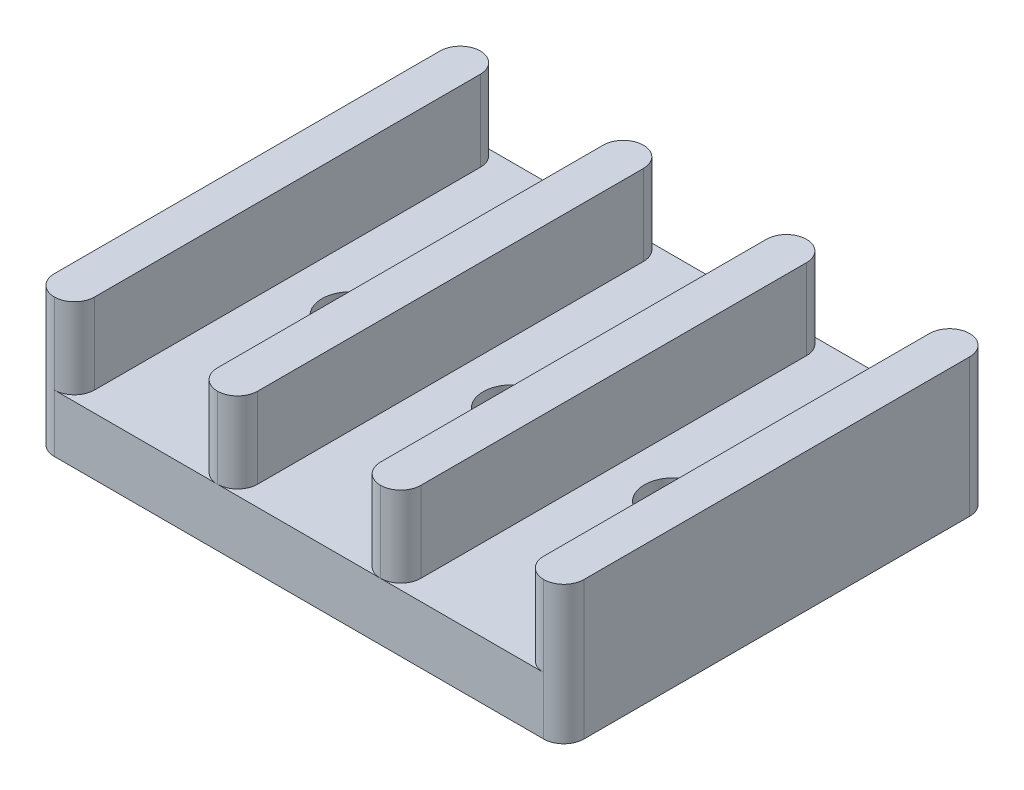
ISO-10303-21;
HEADER;
FILE_DESCRIPTION(('STEP AP214'),'2;1');
FILE_NAME('part.step','',(''),(''),'','','');
FILE_SCHEMA(('AUTOMOTIVE_DESIGN { 1 0 10303 214 1 1 1 1 }'));
ENDSEC;
DATA;
#1=APPLICATION_CONTEXT('core data for automotive mechanical design processes');
#2=APPLICATION_PROTOCOL_DEFINITION('international standard','automotive_design',2000,#1);
#3=PRODUCT_CONTEXT('',#1,'mechanical');
#4=PRODUCT('Part','Part','',(#3));
#5=PRODUCT_RELATED_PRODUCT_CATEGORY('part','',(#4));
#6=PRODUCT_DEFINITION_FORMATION('','',#4);
#7=PRODUCT_DEFINITION_CONTEXT('part definition',#1,'design');
#8=PRODUCT_DEFINITION('design','',#6,#7);
#9=PRODUCT_DEFINITION_SHAPE('','',#8);
#10=(LENGTH_UNIT() NAMED_UNIT(*) SI_UNIT(.MILLI.,.METRE.));
#11=(NAMED_UNIT(*) PLANE_ANGLE_UNIT() SI_UNIT($,.RADIAN.));
#12=(NAMED_UNIT(*) SI_UNIT($,.STERADIAN.) SOLID_ANGLE_UNIT());
#13=UNCERTAINTY_MEASURE_WITH_UNIT(LENGTH_MEASURE(1.E-05),#10,'distance_accuracy_value','');
#14=(GEOMETRIC_REPRESENTATION_CONTEXT(3) GLOBAL_UNCERTAINTY_ASSIGNED_CONTEXT((#13)) GLOBAL_UNIT_ASSIGNED_CONTEXT((#10,
#11,#12)) REPRESENTATION_CONTEXT('',''));
#15=CARTESIAN_POINT('',(0.,0.,0.));
#16=DIRECTION('',(0.,0.,1.));
#17=DIRECTION('',(1.,0.,0.));
#18=AXIS2_PLACEMENT_3D('',#15,#16,#17);
#19=CARTESIAN_POINT('',(0.,12.,0.));
#20=DIRECTION('',(0.,1.,0.));
#21=DIRECTION('',(0.,0.,1.));
#22=AXIS2_PLACEMENT_3D('',#19,#20,#21);
#23=PLANE('',#22);
#24=CARTESIAN_POINT('',(-8.48242676399027,12.,13.1453771289538));
#25=DIRECTION('',(0.,1.,0.));
#26=DIRECTION('',(0.,0.,1.));
#27=AXIS2_PLACEMENT_3D('',#24,#25,#26);
#28=CIRCLE('',#27,1.75);
#29=CARTESIAN_POINT('',(-10.2324267639903,12.,13.1453771289538));
#30=VERTEX_POINT('',#29);
#31=CARTESIAN_POINT('',(-8.48242676399028,12.,14.8953771289538));
#32=VERTEX_POINT('',#31);
#33=EDGE_CURVE('E247',#30,#32,#28,.T.);
#34=ORIENTED_EDGE('',*,*,#33,.T.);
#35=CARTESIAN_POINT('',(-8.48242676399027,12.,13.1453771289538));
#36=DIRECTION('',(0.,1.,0.));
#37=DIRECTION('',(0.,0.,1.));
#38=AXIS2_PLACEMENT_3D('',#35,#36,#37);
#39=CIRCLE('',#38,1.75);
#40=CARTESIAN_POINT('',(-6.73242676399027,12.,13.1453771289538));
#41=VERTEX_POINT('',#40);
#42=EDGE_CURVE('E249',#32,#41,#39,.T.);
#43=ORIENTED_EDGE('',*,*,#42,.T.);
#44=DIRECTION('',(0.,0.,1.));
#45=VECTOR('',#44,1.);
#46=CARTESIAN_POINT('',(-6.73242676399027,12.,0.));
#47=LINE('',#46,#45);
#48=CARTESIAN_POINT('',(-6.73242676399027,12.,-20.3546228710462));
#49=VERTEX_POINT('',#48);
#50=EDGE_CURVE('E229',#49,#41,#47,.T.);
#51=ORIENTED_EDGE('',*,*,#50,.F.);
#52=CARTESIAN_POINT('',(-8.48242676399027,12.,-20.3546228710462));
#53=DIRECTION('',(0.,1.,0.));
#54=DIRECTION('',(0.,0.,1.));
#55=AXIS2_PLACEMENT_3D('',#52,#53,#54);
#56=CIRCLE('',#55,1.75);
#57=CARTESIAN_POINT('',(-8.48242676399028,12.,-22.1046228710462));
#58=VERTEX_POINT('',#57);
#59=EDGE_CURVE('E222',#49,#58,#56,.T.);
#60=ORIENTED_EDGE('',*,*,#59,.T.);
#61=CARTESIAN_POINT('',(-8.48242676399028,12.,-20.3546228710462));
#62=DIRECTION('',(0.,1.,0.));
#63=DIRECTION('',(0.,0.,1.));
#64=AXIS2_PLACEMENT_3D('',#61,#62,#63);
#65=CIRCLE('',#64,1.75);
#66=CARTESIAN_POINT('',(-10.2324267639903,12.,-20.3546228710462));
#67=VERTEX_POINT('',#66);
#68=EDGE_CURVE('E226',#58,#67,#65,.T.);
#69=ORIENTED_EDGE('',*,*,#68,.T.);
#70=DIRECTION('',(0.,0.,1.));
#71=VECTOR('',#70,1.);
#72=CARTESIAN_POINT('',(-10.2324267639903,12.,0.));
#73=LINE('',#72,#71);
#74=EDGE_CURVE('E403',#67,#30,#73,.T.);
#75=ORIENTED_EDGE('',*,*,#74,.T.);
#76=EDGE_LOOP('',(#34,#43,#51,#60,#69,#75));
#77=FACE_BOUND('',#76,.T.);
#78=ADVANCED_FACE('F39',(#77),#23,.T.);
#79=DIRECTION('',(0.,0.,1.));
#80=VECTOR('',#79,1.);
#81=CARTESIAN_POINT('',(3.93417323600973,12.,0.));
#82=LINE('',#81,#80);
#83=CARTESIAN_POINT('',(3.93417323600973,12.,-20.3546228710462));
#84=VERTEX_POINT('',#83);
#85=CARTESIAN_POINT('',(3.93417323600973,12.,13.1453771289538));
#86=VERTEX_POINT('',#85);
#87=EDGE_CURVE('E378',#84,#86,#82,.T.);
#88=ORIENTED_EDGE('',*,*,#87,.T.);
#89=CARTESIAN_POINT('',(5.68417323600973,12.,13.1453771289538));
#90=DIRECTION('',(0.,1.,0.));
#91=DIRECTION('',(0.,0.,1.));
#92=AXIS2_PLACEMENT_3D('',#89,#90,#91);
#93=CIRCLE('',#92,1.75);
#94=CARTESIAN_POINT('',(5.68417323600973,12.,14.8953771289538));
#95=VERTEX_POINT('',#94);
#96=EDGE_CURVE('E364',#86,#95,#93,.T.);
#97=ORIENTED_EDGE('',*,*,#96,.T.);
#98=CARTESIAN_POINT('',(5.68417323600973,12.,13.1453771289538));
#99=DIRECTION('',(0.,1.,0.));
#100=DIRECTION('',(0.,0.,1.));
#101=AXIS2_PLACEMENT_3D('',#98,#99,#100);
#102=CIRCLE('',#101,1.75);
#103=CARTESIAN_POINT('',(7.43417323600973,12.,13.1453771289538));
#104=VERTEX_POINT('',#103);
#105=EDGE_CURVE('E362',#95,#104,#102,.T.);
#106=ORIENTED_EDGE('',*,*,#105,.T.);
#107=DIRECTION('',(0.,0.,1.));
#108=VECTOR('',#107,1.);
#109=CARTESIAN_POINT('',(7.43417323600973,12.,0.));
#110=LINE('',#109,#108);
#111=CARTESIAN_POINT('',(7.43417323600973,12.,-20.3546228710462));
#112=VERTEX_POINT('',#111);
#113=EDGE_CURVE('E410',#112,#104,#110,.T.);
#114=ORIENTED_EDGE('',*,*,#113,.F.);
#115=CARTESIAN_POINT('',(5.68417323600973,12.,-20.3546228710462));
#116=DIRECTION('',(0.,1.,0.));
#117=DIRECTION('',(0.,0.,1.));
#118=AXIS2_PLACEMENT_3D('',#115,#116,#117);
#119=CIRCLE('',#118,1.75);
#120=CARTESIAN_POINT('',(5.68417323600973,12.,-22.1046228710462));
#121=VERTEX_POINT('',#120);
#122=EDGE_CURVE('E358',#112,#121,#119,.T.);
#123=ORIENTED_EDGE('',*,*,#122,.T.);
#124=CARTESIAN_POINT('',(5.68417323600973,12.,-20.3546228710462));
#125=DIRECTION('',(0.,1.,0.));
#126=DIRECTION('',(0.,0.,1.));
#127=AXIS2_PLACEMENT_3D('',#124,#125,#126);
#128=CIRCLE('',#127,1.75);
#129=EDGE_CURVE('E360',#121,#84,#128,.T.);
#130=ORIENTED_EDGE('',*,*,#129,.T.);
#131=EDGE_LOOP('',(#88,#97,#106,#114,#123,#130));
#132=FACE_BOUND('',#131,.T.);
#133=ADVANCED_FACE('F528',(#132),#23,.T.);
#134=DIRECTION('',(-1.,0.,0.));
#135=VECTOR('',#134,1.);
#136=CARTESIAN_POINT('',(21.6009732360097,12.,-22.1046228710462));
#137=LINE('',#136,#135);
#138=CARTESIAN_POINT('',(19.8509732360097,12.,-22.1046228710462));
#139=VERTEX_POINT('',#138);
#140=CARTESIAN_POINT('',(19.8507732360097,12.,-22.1046228710462));
#141=VERTEX_POINT('',#140);
#142=EDGE_CURVE('E437',#139,#141,#137,.T.);
#143=ORIENTED_EDGE('',*,*,#142,.T.);
#144=CARTESIAN_POINT('',(19.8507732360097,12.,-20.3546228710462));
#145=DIRECTION('',(0.,1.,0.));
#146=DIRECTION('',(0.,0.,1.));
#147=AXIS2_PLACEMENT_3D('',#144,#145,#146);
#148=CIRCLE('',#147,1.75);
#149=CARTESIAN_POINT('',(18.1007732360097,12.,-20.3546228710462));
#150=VERTEX_POINT('',#149);
#151=EDGE_CURVE('E470',#141,#150,#148,.T.);
#152=ORIENTED_EDGE('',*,*,#151,.T.);
#153=DIRECTION('',(0.,0.,1.));
#154=VECTOR('',#153,1.);
#155=CARTESIAN_POINT('',(18.1007732360097,12.,0.));
#156=LINE('',#155,#154);
#157=CARTESIAN_POINT('',(18.1007732360097,12.,13.1453771289538));
#158=VERTEX_POINT('',#157);
#159=EDGE_CURVE('E320',#150,#158,#156,.T.);
#160=ORIENTED_EDGE('',*,*,#159,.T.);
#161=CARTESIAN_POINT('',(19.8507732360097,12.,13.1453771289538));
#162=DIRECTION('',(0.,1.,0.));
#163=DIRECTION('',(0.,0.,1.));
#164=AXIS2_PLACEMENT_3D('',#161,#162,#163);
#165=CIRCLE('',#164,1.75);
#166=CARTESIAN_POINT('',(19.8507732360097,12.,14.8953771289538));
#167=VERTEX_POINT('',#166);
#168=EDGE_CURVE('E468',#158,#167,#165,.T.);
#169=ORIENTED_EDGE('',*,*,#168,.T.);
#170=DIRECTION('',(1.,0.,0.));
#171=VECTOR('',#170,1.);
#172=CARTESIAN_POINT('',(21.6009732360097,12.,14.8953771289538));
#173=LINE('',#172,#171);
#174=CARTESIAN_POINT('',(19.8509732360097,12.,14.8953771289538));
#175=VERTEX_POINT('',#174);
#176=EDGE_CURVE('E444',#167,#175,#173,.T.);
#177=ORIENTED_EDGE('',*,*,#176,.T.);
#178=CARTESIAN_POINT('',(19.8509732360097,12.,13.1453771289538));
#179=DIRECTION('',(0.,1.,0.));
#180=DIRECTION('',(0.,0.,1.));
#181=AXIS2_PLACEMENT_3D('',#178,#179,#180);
#182=CIRCLE('',#181,1.75);
#183=CARTESIAN_POINT('',(21.6009732360097,12.,13.1453771289538));
#184=VERTEX_POINT('',#183);
#185=EDGE_CURVE('E464',#175,#184,#182,.T.);
#186=ORIENTED_EDGE('',*,*,#185,.T.);
#187=DIRECTION('',(0.,0.,-1.));
#188=VECTOR('',#187,1.);
#189=CARTESIAN_POINT('',(21.6009732360097,12.,14.8953771289538));
#190=LINE('',#189,#188);
#191=CARTESIAN_POINT('',(21.6009732360097,12.,-20.3546228710462));
#192=VERTEX_POINT('',#191);
#193=EDGE_CURVE('E434',#184,#192,#190,.T.);
#194=ORIENTED_EDGE('',*,*,#193,.T.);
#195=CARTESIAN_POINT('',(19.8509732360097,12.,-20.3546228710462));
#196=DIRECTION('',(0.,1.,0.));
#197=DIRECTION('',(0.,0.,1.));
#198=AXIS2_PLACEMENT_3D('',#195,#196,#197);
#199=CIRCLE('',#198,1.75);
#200=EDGE_CURVE('E466',#192,#139,#199,.T.);
#201=ORIENTED_EDGE('',*,*,#200,.T.);
#202=EDGE_LOOP('',(#143,#152,#160,#169,#177,#186,#194,#201));
#203=FACE_BOUND('',#202,.T.);
#204=ADVANCED_FACE('F481',(#203),#23,.T.);
#205=CARTESIAN_POINT('',(21.6009732360097,12.,-22.1046228710462));
#206=DIRECTION('',(0.,0.,1.));
#207=DIRECTION('',(1.,0.,0.));
#208=AXIS2_PLACEMENT_3D('',#205,#206,#207);
#209=PLANE('',#208);
#210=DIRECTION('',(-1.,0.,0.));
#211=VECTOR('',#210,1.);
#212=CARTESIAN_POINT('',(0.,5.,-22.1046228710462));
#213=LINE('',#212,#211);
#214=CARTESIAN_POINT('',(19.8507732360097,5.,-22.1046228710462));
#215=VERTEX_POINT('',#214);
#216=CARTESIAN_POINT('',(5.68417323600973,5.,-22.1046228710462));
#217=VERTEX_POINT('',#216);
#218=EDGE_CURVE('E409',#215,#217,#213,.T.);
#219=ORIENTED_EDGE('',*,*,#218,.F.);
#220=DIRECTION('',(0.,1.,0.));
#221=VECTOR('',#220,1.);
#222=CARTESIAN_POINT('',(19.8507732360097,12.,-22.1046228710462));
#223=LINE('',#222,#221);
#224=EDGE_CURVE('E461',#215,#141,#223,.T.);
#225=ORIENTED_EDGE('',*,*,#224,.T.);
#226=ORIENTED_EDGE('',*,*,#142,.F.);
#227=DIRECTION('',(0.,-1.,0.));
#228=VECTOR('',#227,1.);
#229=CARTESIAN_POINT('',(19.8509732360097,12.,-22.1046228710462));
#230=LINE('',#229,#228);
#231=CARTESIAN_POINT('',(19.8509732360097,0.,-22.1046228710462));
#232=VERTEX_POINT('',#231);
#233=EDGE_CURVE('E447',#139,#232,#230,.T.);
#234=ORIENTED_EDGE('',*,*,#233,.T.);
#235=DIRECTION('',(-1.,0.,0.));
#236=VECTOR('',#235,1.);
#237=CARTESIAN_POINT('',(21.6009732360097,0.,-22.1046228710462));
#238=LINE('',#237,#236);
#239=CARTESIAN_POINT('',(-22.6490267639903,0.,-22.1046228710462));
#240=VERTEX_POINT('',#239);
#241=EDGE_CURVE('E449',#232,#240,#238,.T.);
#242=ORIENTED_EDGE('',*,*,#241,.T.);
#243=DIRECTION('',(0.,-1.,0.));
#244=VECTOR('',#243,1.);
#245=CARTESIAN_POINT('',(-22.6490267639903,12.,-22.1046228710462));
#246=LINE('',#245,#244);
#247=CARTESIAN_POINT('',(-22.6490267639903,5.,-22.1046228710462));
#248=VERTEX_POINT('',#247);
#249=EDGE_CURVE('E458',#240,#248,#246,.F.);
#250=ORIENTED_EDGE('',*,*,#249,.T.);
#251=DIRECTION('',(-1.,0.,0.));
#252=VECTOR('',#251,1.);
#253=CARTESIAN_POINT('',(0.,5.,-22.1046228710462));
#254=LINE('',#253,#252);
#255=CARTESIAN_POINT('',(-8.48242676399027,5.,-22.1046228710462));
#256=VERTEX_POINT('',#255);
#257=EDGE_CURVE('E857',#256,#248,#254,.T.);
#258=ORIENTED_EDGE('',*,*,#257,.F.);
#259=DIRECTION('',(-1.,0.,0.));
#260=VECTOR('',#259,1.);
#261=CARTESIAN_POINT('',(0.,5.,-22.1046228710462));
#262=LINE('',#261,#260);
#263=EDGE_CURVE('E387',#217,#256,#262,.T.);
#264=ORIENTED_EDGE('',*,*,#263,.F.);
#265=EDGE_LOOP('',(#219,#225,#226,#234,#242,#250,#258,#264));
#266=FACE_BOUND('',#265,.T.);
#267=ADVANCED_FACE('F489',(#266),#209,.F.);
#268=CARTESIAN_POINT('',(21.6009732360097,12.,14.8953771289538));
#269=DIRECTION('',(0.,0.,-1.));
#270=DIRECTION('',(-1.,0.,0.));
#271=AXIS2_PLACEMENT_3D('',#268,#269,#270);
#272=PLANE('',#271);
#273=ORIENTED_EDGE('',*,*,#176,.F.);
#274=DIRECTION('',(0.,1.,0.));
#275=VECTOR('',#274,1.);
#276=CARTESIAN_POINT('',(19.8507732360097,5.,14.8953771289538));
#277=LINE('',#276,#275);
#278=CARTESIAN_POINT('',(19.8507732360097,5.,14.8953771289538));
#279=VERTEX_POINT('',#278);
#280=EDGE_CURVE('E350',#167,#279,#277,.F.);
#281=ORIENTED_EDGE('',*,*,#280,.T.);
#282=DIRECTION('',(1.,0.,0.));
#283=VECTOR('',#282,1.);
#284=CARTESIAN_POINT('',(0.,5.,14.8953771289538));
#285=LINE('',#284,#283);
#286=CARTESIAN_POINT('',(5.68417323600973,5.,14.8953771289538));
#287=VERTEX_POINT('',#286);
#288=EDGE_CURVE('E415',#287,#279,#285,.T.);
#289=ORIENTED_EDGE('',*,*,#288,.F.);
#290=DIRECTION('',(1.,0.,0.));
#291=VECTOR('',#290,1.);
#292=CARTESIAN_POINT('',(0.,5.,14.8953771289538));
#293=LINE('',#292,#291);
#294=CARTESIAN_POINT('',(-8.48242676399027,5.,14.8953771289538));
#295=VERTEX_POINT('',#294);
#296=EDGE_CURVE('E398',#295,#287,#293,.T.);
#297=ORIENTED_EDGE('',*,*,#296,.F.);
#298=DIRECTION('',(1.,0.,0.));
#299=VECTOR('',#298,1.);
#300=CARTESIAN_POINT('',(0.,5.,14.8953771289538));
#301=LINE('',#300,#299);
#302=CARTESIAN_POINT('',(-22.6490267639903,5.,14.8953771289538));
#303=VERTEX_POINT('',#302);
#304=EDGE_CURVE('E848',#303,#295,#301,.T.);
#305=ORIENTED_EDGE('',*,*,#304,.F.);
#306=DIRECTION('',(0.,-1.,0.));
#307=VECTOR('',#306,1.);
#308=CARTESIAN_POINT('',(-22.6490267639903,12.,14.8953771289538));
#309=LINE('',#308,#307);
#310=CARTESIAN_POINT('',(-22.6490267639903,0.,14.8953771289538));
#311=VERTEX_POINT('',#310);
#312=EDGE_CURVE('E343',#303,#311,#309,.T.);
#313=ORIENTED_EDGE('',*,*,#312,.T.);
#314=DIRECTION('',(1.,0.,0.));
#315=VECTOR('',#314,1.);
#316=CARTESIAN_POINT('',(21.6009732360097,0.,14.8953771289538));
#317=LINE('',#316,#315);
#318=CARTESIAN_POINT('',(19.8509732360097,0.,14.8953771289538));
#319=VERTEX_POINT('',#318);
#320=EDGE_CURVE('E438',#311,#319,#317,.T.);
#321=ORIENTED_EDGE('',*,*,#320,.T.);
#322=DIRECTION('',(0.,-1.,0.));
#323=VECTOR('',#322,1.);
#324=CARTESIAN_POINT('',(19.8509732360097,12.,14.8953771289538));
#325=LINE('',#324,#323);
#326=EDGE_CURVE('E347',#319,#175,#325,.F.);
#327=ORIENTED_EDGE('',*,*,#326,.T.);
#328=EDGE_LOOP('',(#273,#281,#289,#297,#305,#313,#321,#327));
#329=FACE_BOUND('',#328,.T.);
#330=ADVANCED_FACE('F498',(#329),#272,.F.);
#331=CARTESIAN_POINT('',(-1.39902676399028,12.,-3.60462287104624));
#332=DIRECTION('',(0.,-1.,0.));
#333=DIRECTION('',(0.,0.,-1.));
#334=AXIS2_PLACEMENT_3D('',#331,#332,#333);
#335=CYLINDRICAL_SURFACE('',#334,2.5);
#336=CARTESIAN_POINT('',(-1.39902676399028,0.,-3.60462287104624));
#337=DIRECTION('',(0.,1.,0.));
#338=DIRECTION('',(0.,0.,1.));
#339=AXIS2_PLACEMENT_3D('',#336,#337,#338);
#340=CIRCLE('',#339,2.5);
#341=CARTESIAN_POINT('',(-1.39902676399028,0.,-1.10462287104624));
#342=VERTEX_POINT('',#341);
#343=EDGE_CURVE('E430',#342,#342,#340,.T.);
#344=ORIENTED_EDGE('',*,*,#343,.F.);
#345=EDGE_LOOP('',(#344));
#346=FACE_BOUND('',#345,.T.);
#347=CARTESIAN_POINT('',(-1.39902676399028,5.,-3.60462287104624));
#348=DIRECTION('',(0.,1.,0.));
#349=DIRECTION('',(0.,0.,1.));
#350=AXIS2_PLACEMENT_3D('',#347,#348,#349);
#351=CIRCLE('',#350,2.5);
#352=CARTESIAN_POINT('',(-1.39902676399028,5.,-1.10462287104624));
#353=VERTEX_POINT('',#352);
#354=EDGE_CURVE('E400',#353,#353,#351,.F.);
#355=ORIENTED_EDGE('',*,*,#354,.F.);
#356=EDGE_LOOP('',(#355));
#357=FACE_BOUND('',#356,.T.);
#358=ADVANCED_FACE('F556',(#346,#357),#335,.F.);
#359=CARTESIAN_POINT('',(-15.3990267639903,12.,-3.60462287104624));
#360=DIRECTION('',(0.,-1.,0.));
#361=DIRECTION('',(0.,0.,-1.));
#362=AXIS2_PLACEMENT_3D('',#359,#360,#361);
#363=CYLINDRICAL_SURFACE('',#362,2.5);
#364=CARTESIAN_POINT('',(-15.3990267639903,0.,-3.60462287104624));
#365=DIRECTION('',(0.,1.,0.));
#366=DIRECTION('',(0.,0.,1.));
#367=AXIS2_PLACEMENT_3D('',#364,#365,#366);
#368=CIRCLE('',#367,2.5);
#369=CARTESIAN_POINT('',(-15.3990267639903,0.,-1.10462287104624));
#370=VERTEX_POINT('',#369);
#371=EDGE_CURVE('E426',#370,#370,#368,.T.);
#372=ORIENTED_EDGE('',*,*,#371,.F.);
#373=EDGE_LOOP('',(#372));
#374=FACE_BOUND('',#373,.T.);
#375=CARTESIAN_POINT('',(-15.3990267639903,5.,-3.60462287104624));
#376=DIRECTION('',(0.,1.,0.));
#377=DIRECTION('',(0.,0.,1.));
#378=AXIS2_PLACEMENT_3D('',#375,#376,#377);
#379=CIRCLE('',#378,2.5);
#380=CARTESIAN_POINT('',(-15.3990267639903,5.,-1.10462287104624));
#381=VERTEX_POINT('',#380);
#382=EDGE_CURVE('E427',#381,#381,#379,.F.);
#383=ORIENTED_EDGE('',*,*,#382,.F.);
#384=EDGE_LOOP('',(#383));
#385=FACE_BOUND('',#384,.T.);
#386=ADVANCED_FACE('F545',(#374,#385),#363,.F.);
#387=CARTESIAN_POINT('',(12.6009732360097,12.,-3.60462287104624));
#388=DIRECTION('',(0.,-1.,0.));
#389=DIRECTION('',(0.,0.,-1.));
#390=AXIS2_PLACEMENT_3D('',#387,#388,#389);
#391=CYLINDRICAL_SURFACE('',#390,2.5);
#392=CARTESIAN_POINT('',(12.6009732360097,0.,-3.60462287104624));
#393=DIRECTION('',(0.,1.,0.));
#394=DIRECTION('',(0.,0.,1.));
#395=AXIS2_PLACEMENT_3D('',#392,#393,#394);
#396=CIRCLE('',#395,2.5);
#397=CARTESIAN_POINT('',(12.6009732360097,0.,-1.10462287104624));
#398=VERTEX_POINT('',#397);
#399=EDGE_CURVE('E423',#398,#398,#396,.T.);
#400=ORIENTED_EDGE('',*,*,#399,.F.);
#401=EDGE_LOOP('',(#400));
#402=FACE_BOUND('',#401,.T.);
#403=CARTESIAN_POINT('',(12.6009732360097,5.,-3.60462287104624));
#404=DIRECTION('',(0.,1.,0.));
#405=DIRECTION('',(0.,0.,1.));
#406=AXIS2_PLACEMENT_3D('',#403,#404,#405);
#407=CIRCLE('',#406,2.5);
#408=CARTESIAN_POINT('',(12.6009732360097,5.,-1.10462287104624));
#409=VERTEX_POINT('',#408);
#410=EDGE_CURVE('E404',#409,#409,#407,.F.);
#411=ORIENTED_EDGE('',*,*,#410,.F.);
#412=EDGE_LOOP('',(#411));
#413=FACE_BOUND('',#412,.T.);
#414=ADVANCED_FACE('F539',(#402,#413),#391,.F.);
#415=DIRECTION('',(0.,0.,1.));
#416=VECTOR('',#415,1.);
#417=CARTESIAN_POINT('',(-20.8990267639903,12.,0.));
#418=LINE('',#417,#416);
#419=CARTESIAN_POINT('',(-20.8990267639903,12.,-20.3546228710462));
#420=VERTEX_POINT('',#419);
#421=CARTESIAN_POINT('',(-20.8990267639903,12.,13.1453771289538));
#422=VERTEX_POINT('',#421);
#423=EDGE_CURVE('E393',#420,#422,#418,.T.);
#424=ORIENTED_EDGE('',*,*,#423,.F.);
#425=CARTESIAN_POINT('',(-22.6490267639903,12.,-20.3546228710462));
#426=DIRECTION('',(0.,1.,0.));
#427=DIRECTION('',(0.,0.,1.));
#428=AXIS2_PLACEMENT_3D('',#425,#426,#427);
#429=CIRCLE('',#428,1.75);
#430=CARTESIAN_POINT('',(-22.6490267639903,12.,-22.1046228710462));
#431=VERTEX_POINT('',#430);
#432=EDGE_CURVE('E278',#420,#431,#429,.T.);
#433=ORIENTED_EDGE('',*,*,#432,.T.);
#434=CARTESIAN_POINT('',(-22.6490267639903,12.,-20.3546228710462));
#435=DIRECTION('',(0.,1.,0.));
#436=DIRECTION('',(0.,0.,1.));
#437=AXIS2_PLACEMENT_3D('',#434,#435,#436);
#438=CIRCLE('',#437,1.75);
#439=CARTESIAN_POINT('',(-24.3990267639903,12.,-20.3546228710462));
#440=VERTEX_POINT('',#439);
#441=EDGE_CURVE('E276',#431,#440,#438,.T.);
#442=ORIENTED_EDGE('',*,*,#441,.T.);
#443=DIRECTION('',(0.,0.,1.));
#444=VECTOR('',#443,1.);
#445=CARTESIAN_POINT('',(-24.3990267639903,12.,14.8953771289538));
#446=LINE('',#445,#444);
#447=CARTESIAN_POINT('',(-24.3990267639903,12.,13.1453771289538));
#448=VERTEX_POINT('',#447);
#449=EDGE_CURVE('E441',#440,#448,#446,.T.);
#450=ORIENTED_EDGE('',*,*,#449,.T.);
#451=CARTESIAN_POINT('',(-22.6490267639903,12.,13.1453771289538));
#452=DIRECTION('',(0.,1.,0.));
#453=DIRECTION('',(0.,0.,1.));
#454=AXIS2_PLACEMENT_3D('',#451,#452,#453);
#455=CIRCLE('',#454,1.75);
#456=CARTESIAN_POINT('',(-22.6490267639903,12.,14.8953771289538));
#457=VERTEX_POINT('',#456);
#458=EDGE_CURVE('E272',#448,#457,#455,.T.);
#459=ORIENTED_EDGE('',*,*,#458,.T.);
#460=CARTESIAN_POINT('',(-22.6490267639903,12.,13.1453771289538));
#461=DIRECTION('',(0.,1.,0.));
#462=DIRECTION('',(0.,0.,1.));
#463=AXIS2_PLACEMENT_3D('',#460,#461,#462);
#464=CIRCLE('',#463,1.75);
#465=EDGE_CURVE('E274',#457,#422,#464,.T.);
#466=ORIENTED_EDGE('',*,*,#465,.T.);
#467=EDGE_LOOP('',(#424,#433,#442,#450,#459,#466));
#468=FACE_BOUND('',#467,.T.);
#469=ADVANCED_FACE('F530',(#468),#23,.T.);
#470=CARTESIAN_POINT('',(0.,0.,0.));
#471=DIRECTION('',(0.,1.,0.));
#472=DIRECTION('',(0.,0.,1.));
#473=AXIS2_PLACEMENT_3D('',#470,#471,#472);
#474=PLANE('',#473);
#475=DIRECTION('',(0.,0.,1.));
#476=VECTOR('',#475,1.);
#477=CARTESIAN_POINT('',(-24.3990267639903,0.,14.8953771289538));
#478=LINE('',#477,#476);
#479=CARTESIAN_POINT('',(-24.3990267639903,0.,-20.3546228710462));
#480=VERTEX_POINT('',#479);
#481=CARTESIAN_POINT('',(-24.3990267639903,0.,13.1453771289538));
#482=VERTEX_POINT('',#481);
#483=EDGE_CURVE('E452',#480,#482,#478,.T.);
#484=ORIENTED_EDGE('',*,*,#483,.F.);
#485=CARTESIAN_POINT('',(-22.6490267639903,0.,-20.3546228710462));
#486=DIRECTION('',(0.,1.,0.));
#487=DIRECTION('',(0.,0.,1.));
#488=AXIS2_PLACEMENT_3D('',#485,#486,#487);
#489=CIRCLE('',#488,1.75);
#490=EDGE_CURVE('E288',#480,#240,#489,.F.);
#491=ORIENTED_EDGE('',*,*,#490,.T.);
#492=ORIENTED_EDGE('',*,*,#241,.F.);
#493=CARTESIAN_POINT('',(19.8509732360097,0.,-20.3546228710462));
#494=DIRECTION('',(0.,1.,0.));
#495=DIRECTION('',(0.,0.,1.));
#496=AXIS2_PLACEMENT_3D('',#493,#494,#495);
#497=CIRCLE('',#496,1.75);
#498=CARTESIAN_POINT('',(21.6009732360097,0.,-20.3546228710462));
#499=VERTEX_POINT('',#498);
#500=EDGE_CURVE('E56',#232,#499,#497,.F.);
#501=ORIENTED_EDGE('',*,*,#500,.T.);
#502=DIRECTION('',(0.,0.,-1.));
#503=VECTOR('',#502,1.);
#504=CARTESIAN_POINT('',(21.6009732360097,0.,14.8953771289538));
#505=LINE('',#504,#503);
#506=CARTESIAN_POINT('',(21.6009732360097,0.,13.1453771289538));
#507=VERTEX_POINT('',#506);
#508=EDGE_CURVE('E433',#507,#499,#505,.T.);
#509=ORIENTED_EDGE('',*,*,#508,.F.);
#510=CARTESIAN_POINT('',(19.8509732360097,0.,13.1453771289538));
#511=DIRECTION('',(0.,1.,0.));
#512=DIRECTION('',(0.,0.,1.));
#513=AXIS2_PLACEMENT_3D('',#510,#511,#512);
#514=CIRCLE('',#513,1.75);
#515=EDGE_CURVE('E64',#507,#319,#514,.F.);
#516=ORIENTED_EDGE('',*,*,#515,.T.);
#517=ORIENTED_EDGE('',*,*,#320,.F.);
#518=CARTESIAN_POINT('',(-22.6490267639903,0.,13.1453771289538));
#519=DIRECTION('',(0.,1.,0.));
#520=DIRECTION('',(0.,0.,1.));
#521=AXIS2_PLACEMENT_3D('',#518,#519,#520);
#522=CIRCLE('',#521,1.75);
#523=EDGE_CURVE('E284',#311,#482,#522,.F.);
#524=ORIENTED_EDGE('',*,*,#523,.T.);
#525=EDGE_LOOP('',(#484,#491,#492,#501,#509,#516,#517,#524));
#526=FACE_BOUND('',#525,.T.);
#527=ORIENTED_EDGE('',*,*,#343,.T.);
#528=EDGE_LOOP('',(#527));
#529=FACE_BOUND('',#528,.T.);
#530=ORIENTED_EDGE('',*,*,#371,.T.);
#531=EDGE_LOOP('',(#530));
#532=FACE_BOUND('',#531,.T.);
#533=ORIENTED_EDGE('',*,*,#399,.T.);
#534=EDGE_LOOP('',(#533));
#535=FACE_BOUND('',#534,.T.);
#536=ADVANCED_FACE('F506',(#526,#529,#532,#535),#474,.F.);
#537=CARTESIAN_POINT('',(21.6009732360097,12.,14.8953771289538));
#538=DIRECTION('',(-1.,0.,0.));
#539=DIRECTION('',(0.,0.,1.));
#540=AXIS2_PLACEMENT_3D('',#537,#538,#539);
#541=PLANE('',#540);
#542=ORIENTED_EDGE('',*,*,#508,.T.);
#543=DIRECTION('',(0.,-1.,0.));
#544=VECTOR('',#543,1.);
#545=CARTESIAN_POINT('',(21.6009732360097,12.,-20.3546228710462));
#546=LINE('',#545,#544);
#547=EDGE_CURVE('E292',#499,#192,#546,.F.);
#548=ORIENTED_EDGE('',*,*,#547,.T.);
#549=ORIENTED_EDGE('',*,*,#193,.F.);
#550=DIRECTION('',(0.,-1.,0.));
#551=VECTOR('',#550,1.);
#552=CARTESIAN_POINT('',(21.6009732360097,12.,13.1453771289538));
#553=LINE('',#552,#551);
#554=EDGE_CURVE('E290',#184,#507,#553,.T.);
#555=ORIENTED_EDGE('',*,*,#554,.T.);
#556=EDGE_LOOP('',(#542,#548,#549,#555));
#557=FACE_BOUND('',#556,.T.);
#558=ADVANCED_FACE('F503',(#557),#541,.F.);
#559=CARTESIAN_POINT('',(-24.3990267639903,12.,14.8953771289538));
#560=DIRECTION('',(1.,0.,0.));
#561=DIRECTION('',(0.,0.,-1.));
#562=AXIS2_PLACEMENT_3D('',#559,#560,#561);
#563=PLANE('',#562);
#564=ORIENTED_EDGE('',*,*,#449,.F.);
#565=DIRECTION('',(0.,-1.,0.));
#566=VECTOR('',#565,1.);
#567=CARTESIAN_POINT('',(-24.3990267639903,12.,-20.3546228710462));
#568=LINE('',#567,#566);
#569=EDGE_CURVE('E282',#440,#480,#568,.T.);
#570=ORIENTED_EDGE('',*,*,#569,.T.);
#571=ORIENTED_EDGE('',*,*,#483,.T.);
#572=DIRECTION('',(0.,-1.,0.));
#573=VECTOR('',#572,1.);
#574=CARTESIAN_POINT('',(-24.3990267639903,12.,13.1453771289538));
#575=LINE('',#574,#573);
#576=EDGE_CURVE('E280',#482,#448,#575,.F.);
#577=ORIENTED_EDGE('',*,*,#576,.T.);
#578=EDGE_LOOP('',(#564,#570,#571,#577));
#579=FACE_BOUND('',#578,.T.);
#580=ADVANCED_FACE('F511',(#579),#563,.F.);
#581=CARTESIAN_POINT('',(18.1007732360097,5.,0.));
#582=DIRECTION('',(-1.,0.,0.));
#583=DIRECTION('',(0.,0.,1.));
#584=AXIS2_PLACEMENT_3D('',#581,#582,#583);
#585=PLANE('',#584);
#586=ORIENTED_EDGE('',*,*,#159,.F.);
#587=DIRECTION('',(0.,1.,0.));
#588=VECTOR('',#587,1.);
#589=CARTESIAN_POINT('',(18.1007732360097,5.,-20.3546228710462));
#590=LINE('',#589,#588);
#591=CARTESIAN_POINT('',(18.1007732360097,5.,-20.3546228710462));
#592=VERTEX_POINT('',#591);
#593=EDGE_CURVE('E348',#150,#592,#590,.F.);
#594=ORIENTED_EDGE('',*,*,#593,.T.);
#595=DIRECTION('',(0.,0.,1.));
#596=VECTOR('',#595,1.);
#597=CARTESIAN_POINT('',(18.1007732360097,5.,0.));
#598=LINE('',#597,#596);
#599=CARTESIAN_POINT('',(18.1007732360097,5.,13.1453771289538));
#600=VERTEX_POINT('',#599);
#601=EDGE_CURVE('E406',#592,#600,#598,.T.);
#602=ORIENTED_EDGE('',*,*,#601,.T.);
#603=DIRECTION('',(0.,1.,0.));
#604=VECTOR('',#603,1.);
#605=CARTESIAN_POINT('',(18.1007732360097,12.,13.1453771289538));
#606=LINE('',#605,#604);
#607=EDGE_CURVE('E352',#600,#158,#606,.T.);
#608=ORIENTED_EDGE('',*,*,#607,.T.);
#609=EDGE_LOOP('',(#586,#594,#602,#608));
#610=FACE_BOUND('',#609,.T.);
#611=ADVANCED_FACE('F475',(#610),#585,.T.);
#612=CARTESIAN_POINT('',(7.43417323600973,5.,0.));
#613=DIRECTION('',(-1.,0.,0.));
#614=DIRECTION('',(0.,0.,1.));
#615=AXIS2_PLACEMENT_3D('',#612,#613,#614);
#616=PLANE('',#615);
#617=ORIENTED_EDGE('',*,*,#113,.T.);
#618=DIRECTION('',(0.,1.,0.));
#619=VECTOR('',#618,1.);
#620=CARTESIAN_POINT('',(7.43417323600973,5.,13.1453771289538));
#621=LINE('',#620,#619);
#622=CARTESIAN_POINT('',(7.43417323600973,5.,13.1453771289538));
#623=VERTEX_POINT('',#622);
#624=EDGE_CURVE('E264',#104,#623,#621,.F.);
#625=ORIENTED_EDGE('',*,*,#624,.T.);
#626=DIRECTION('',(0.,0.,1.));
#627=VECTOR('',#626,1.);
#628=CARTESIAN_POINT('',(7.43417323600973,5.,0.));
#629=LINE('',#628,#627);
#630=CARTESIAN_POINT('',(7.43417323600973,5.,-20.3546228710462));
#631=VERTEX_POINT('',#630);
#632=EDGE_CURVE('E412',#631,#623,#629,.T.);
#633=ORIENTED_EDGE('',*,*,#632,.F.);
#634=DIRECTION('',(0.,1.,0.));
#635=VECTOR('',#634,1.);
#636=CARTESIAN_POINT('',(7.43417323600973,5.,-20.3546228710462));
#637=LINE('',#636,#635);
#638=EDGE_CURVE('E262',#631,#112,#637,.T.);
#639=ORIENTED_EDGE('',*,*,#638,.T.);
#640=EDGE_LOOP('',(#617,#625,#633,#639));
#641=FACE_BOUND('',#640,.T.);
#642=ADVANCED_FACE('F736',(#641),#616,.F.);
#643=CARTESIAN_POINT('',(0.,5.,0.));
#644=DIRECTION('',(0.,1.,0.));
#645=DIRECTION('',(0.,0.,1.));
#646=AXIS2_PLACEMENT_3D('',#643,#644,#645);
#647=PLANE('',#646);
#648=ORIENTED_EDGE('',*,*,#601,.F.);
#649=CARTESIAN_POINT('',(19.8507732360097,5.,-20.3546228710462));
#650=DIRECTION('',(0.,1.,0.));
#651=DIRECTION('',(0.,0.,1.));
#652=AXIS2_PLACEMENT_3D('',#649,#650,#651);
#653=CIRCLE('',#652,1.75);
#654=EDGE_CURVE('E294',#592,#215,#653,.F.);
#655=ORIENTED_EDGE('',*,*,#654,.T.);
#656=ORIENTED_EDGE('',*,*,#218,.T.);
#657=CARTESIAN_POINT('',(5.68417323600973,5.,-20.3546228710462));
#658=DIRECTION('',(0.,1.,0.));
#659=DIRECTION('',(0.,0.,1.));
#660=AXIS2_PLACEMENT_3D('',#657,#658,#659);
#661=CIRCLE('',#660,1.75);
#662=EDGE_CURVE('E315',#217,#631,#661,.F.);
#663=ORIENTED_EDGE('',*,*,#662,.T.);
#664=ORIENTED_EDGE('',*,*,#632,.T.);
#665=CARTESIAN_POINT('',(5.68417323600973,5.,13.1453771289538));
#666=DIRECTION('',(0.,1.,0.));
#667=DIRECTION('',(0.,0.,1.));
#668=AXIS2_PLACEMENT_3D('',#665,#666,#667);
#669=CIRCLE('',#668,1.75);
#670=EDGE_CURVE('E312',#623,#287,#669,.F.);
#671=ORIENTED_EDGE('',*,*,#670,.T.);
#672=ORIENTED_EDGE('',*,*,#288,.T.);
#673=CARTESIAN_POINT('',(19.8507732360097,5.,13.1453771289538));
#674=DIRECTION('',(0.,1.,0.));
#675=DIRECTION('',(0.,0.,1.));
#676=AXIS2_PLACEMENT_3D('',#673,#674,#675);
#677=CIRCLE('',#676,1.75);
#678=EDGE_CURVE('E297',#279,#600,#677,.F.);
#679=ORIENTED_EDGE('',*,*,#678,.T.);
#680=EDGE_LOOP('',(#648,#655,#656,#663,#664,#671,#672,#679));
#681=FACE_BOUND('',#680,.T.);
#682=ORIENTED_EDGE('',*,*,#410,.T.);
#683=EDGE_LOOP('',(#682));
#684=FACE_BOUND('',#683,.T.);
#685=ADVANCED_FACE('F494',(#681,#684),#647,.T.);
#686=CARTESIAN_POINT('',(-10.2324267639903,5.,0.));
#687=DIRECTION('',(-1.,0.,0.));
#688=DIRECTION('',(0.,0.,1.));
#689=AXIS2_PLACEMENT_3D('',#686,#687,#688);
#690=PLANE('',#689);
#691=ORIENTED_EDGE('',*,*,#74,.F.);
#692=DIRECTION('',(0.,1.,0.));
#693=VECTOR('',#692,1.);
#694=CARTESIAN_POINT('',(-10.2324267639903,5.,-20.3546228710462));
#695=LINE('',#694,#693);
#696=CARTESIAN_POINT('',(-10.2324267639903,5.,-20.3546228710462));
#697=VERTEX_POINT('',#696);
#698=EDGE_CURVE('E246',#67,#697,#695,.F.);
#699=ORIENTED_EDGE('',*,*,#698,.T.);
#700=DIRECTION('',(0.,0.,1.));
#701=VECTOR('',#700,1.);
#702=CARTESIAN_POINT('',(-10.2324267639903,5.,0.));
#703=LINE('',#702,#701);
#704=CARTESIAN_POINT('',(-10.2324267639903,5.,13.1453771289538));
#705=VERTEX_POINT('',#704);
#706=EDGE_CURVE('E855',#697,#705,#703,.T.);
#707=ORIENTED_EDGE('',*,*,#706,.T.);
#708=DIRECTION('',(0.,1.,0.));
#709=VECTOR('',#708,1.);
#710=CARTESIAN_POINT('',(-10.2324267639903,12.,13.1453771289538));
#711=LINE('',#710,#709);
#712=EDGE_CURVE('E254',#705,#30,#711,.T.);
#713=ORIENTED_EDGE('',*,*,#712,.T.);
#714=EDGE_LOOP('',(#691,#699,#707,#713));
#715=FACE_BOUND('',#714,.T.);
#716=ADVANCED_FACE('F719',(#715),#690,.T.);
#717=CARTESIAN_POINT('',(-20.8990267639903,5.,0.));
#718=DIRECTION('',(-1.,0.,0.));
#719=DIRECTION('',(0.,0.,1.));
#720=AXIS2_PLACEMENT_3D('',#717,#718,#719);
#721=PLANE('',#720);
#722=DIRECTION('',(0.,0.,1.));
#723=VECTOR('',#722,1.);
#724=CARTESIAN_POINT('',(-20.8990267639903,5.,0.));
#725=LINE('',#724,#723);
#726=CARTESIAN_POINT('',(-20.8990267639903,5.,-20.3546228710462));
#727=VERTEX_POINT('',#726);
#728=CARTESIAN_POINT('',(-20.8990267639903,5.,13.1453771289538));
#729=VERTEX_POINT('',#728);
#730=EDGE_CURVE('E850',#727,#729,#725,.T.);
#731=ORIENTED_EDGE('',*,*,#730,.F.);
#732=DIRECTION('',(0.,1.,0.));
#733=VECTOR('',#732,1.);
#734=CARTESIAN_POINT('',(-20.8990267639903,5.,-20.3546228710462));
#735=LINE('',#734,#733);
#736=EDGE_CURVE('E269',#727,#420,#735,.T.);
#737=ORIENTED_EDGE('',*,*,#736,.T.);
#738=ORIENTED_EDGE('',*,*,#423,.T.);
#739=DIRECTION('',(0.,1.,0.));
#740=VECTOR('',#739,1.);
#741=CARTESIAN_POINT('',(-20.8990267639903,5.,13.1453771289538));
#742=LINE('',#741,#740);
#743=EDGE_CURVE('E266',#422,#729,#742,.F.);
#744=ORIENTED_EDGE('',*,*,#743,.T.);
#745=EDGE_LOOP('',(#731,#737,#738,#744));
#746=FACE_BOUND('',#745,.T.);
#747=ADVANCED_FACE('F710',(#746),#721,.F.);
#748=CARTESIAN_POINT('',(0.,5.,0.));
#749=DIRECTION('',(0.,1.,0.));
#750=DIRECTION('',(0.,0.,1.));
#751=AXIS2_PLACEMENT_3D('',#748,#749,#750);
#752=PLANE('',#751);
#753=ORIENTED_EDGE('',*,*,#706,.F.);
#754=CARTESIAN_POINT('',(-8.48242676399028,5.,-20.3546228710462));
#755=DIRECTION('',(0.,1.,0.));
#756=DIRECTION('',(0.,0.,1.));
#757=AXIS2_PLACEMENT_3D('',#754,#755,#756);
#758=CIRCLE('',#757,1.75);
#759=EDGE_CURVE('E302',#697,#256,#758,.F.);
#760=ORIENTED_EDGE('',*,*,#759,.T.);
#761=ORIENTED_EDGE('',*,*,#257,.T.);
#762=CARTESIAN_POINT('',(-22.6490267639903,5.,-20.3546228710462));
#763=DIRECTION('',(0.,1.,0.));
#764=DIRECTION('',(0.,0.,1.));
#765=AXIS2_PLACEMENT_3D('',#762,#763,#764);
#766=CIRCLE('',#765,1.75);
#767=EDGE_CURVE('E48',#248,#727,#766,.F.);
#768=ORIENTED_EDGE('',*,*,#767,.T.);
#769=ORIENTED_EDGE('',*,*,#730,.T.);
#770=CARTESIAN_POINT('',(-22.6490267639903,5.,13.1453771289538));
#771=DIRECTION('',(0.,1.,0.));
#772=DIRECTION('',(0.,0.,1.));
#773=AXIS2_PLACEMENT_3D('',#770,#771,#772);
#774=CIRCLE('',#773,1.75);
#775=EDGE_CURVE('E11',#729,#303,#774,.F.);
#776=ORIENTED_EDGE('',*,*,#775,.T.);
#777=ORIENTED_EDGE('',*,*,#304,.T.);
#778=CARTESIAN_POINT('',(-8.48242676399027,5.,13.1453771289538));
#779=DIRECTION('',(0.,1.,0.));
#780=DIRECTION('',(0.,0.,1.));
#781=AXIS2_PLACEMENT_3D('',#778,#779,#780);
#782=CIRCLE('',#781,1.75);
#783=EDGE_CURVE('E308',#295,#705,#782,.F.);
#784=ORIENTED_EDGE('',*,*,#783,.T.);
#785=EDGE_LOOP('',(#753,#760,#761,#768,#769,#776,#777,#784));
#786=FACE_BOUND('',#785,.T.);
#787=ORIENTED_EDGE('',*,*,#382,.T.);
#788=EDGE_LOOP('',(#787));
#789=FACE_BOUND('',#788,.T.);
#790=ADVANCED_FACE('F702',(#786,#789),#752,.T.);
#791=CARTESIAN_POINT('',(3.93417323600973,5.,0.));
#792=DIRECTION('',(-1.,0.,0.));
#793=DIRECTION('',(0.,0.,1.));
#794=AXIS2_PLACEMENT_3D('',#791,#792,#793);
#795=PLANE('',#794);
#796=ORIENTED_EDGE('',*,*,#87,.F.);
#797=DIRECTION('',(0.,1.,0.));
#798=VECTOR('',#797,1.);
#799=CARTESIAN_POINT('',(3.93417323600973,5.,-20.3546228710462));
#800=LINE('',#799,#798);
#801=CARTESIAN_POINT('',(3.93417323600973,5.,-20.3546228710462));
#802=VERTEX_POINT('',#801);
#803=EDGE_CURVE('E232',#84,#802,#800,.F.);
#804=ORIENTED_EDGE('',*,*,#803,.T.);
#805=DIRECTION('',(0.,0.,1.));
#806=VECTOR('',#805,1.);
#807=CARTESIAN_POINT('',(3.93417323600973,5.,0.));
#808=LINE('',#807,#806);
#809=CARTESIAN_POINT('',(3.93417323600973,5.,13.1453771289538));
#810=VERTEX_POINT('',#809);
#811=EDGE_CURVE('E375',#802,#810,#808,.T.);
#812=ORIENTED_EDGE('',*,*,#811,.T.);
#813=DIRECTION('',(0.,1.,0.));
#814=VECTOR('',#813,1.);
#815=CARTESIAN_POINT('',(3.93417323600973,12.,13.1453771289538));
#816=LINE('',#815,#814);
#817=EDGE_CURVE('E366',#810,#86,#816,.T.);
#818=ORIENTED_EDGE('',*,*,#817,.T.);
#819=EDGE_LOOP('',(#796,#804,#812,#818));
#820=FACE_BOUND('',#819,.T.);
#821=ADVANCED_FACE('F374',(#820),#795,.T.);
#822=CARTESIAN_POINT('',(-6.73242676399027,5.,0.));
#823=DIRECTION('',(-1.,0.,0.));
#824=DIRECTION('',(0.,0.,1.));
#825=AXIS2_PLACEMENT_3D('',#822,#823,#824);
#826=PLANE('',#825);
#827=ORIENTED_EDGE('',*,*,#50,.T.);
#828=DIRECTION('',(0.,1.,0.));
#829=VECTOR('',#828,1.);
#830=CARTESIAN_POINT('',(-6.73242676399027,5.,13.1453771289538));
#831=LINE('',#830,#829);
#832=CARTESIAN_POINT('',(-6.73242676399027,5.,13.1453771289538));
#833=VERTEX_POINT('',#832);
#834=EDGE_CURVE('E259',#41,#833,#831,.F.);
#835=ORIENTED_EDGE('',*,*,#834,.T.);
#836=DIRECTION('',(0.,0.,1.));
#837=VECTOR('',#836,1.);
#838=CARTESIAN_POINT('',(-6.73242676399027,5.,0.));
#839=LINE('',#838,#837);
#840=CARTESIAN_POINT('',(-6.73242676399027,5.,-20.3546228710462));
#841=VERTEX_POINT('',#840);
#842=EDGE_CURVE('E389',#841,#833,#839,.T.);
#843=ORIENTED_EDGE('',*,*,#842,.F.);
#844=DIRECTION('',(0.,1.,0.));
#845=VECTOR('',#844,1.);
#846=CARTESIAN_POINT('',(-6.73242676399027,5.,-20.3546228710462));
#847=LINE('',#846,#845);
#848=EDGE_CURVE('E257',#841,#49,#847,.T.);
#849=ORIENTED_EDGE('',*,*,#848,.T.);
#850=EDGE_LOOP('',(#827,#835,#843,#849));
#851=FACE_BOUND('',#850,.T.);
#852=ADVANCED_FACE('F686',(#851),#826,.F.);
#853=CARTESIAN_POINT('',(0.,5.,0.));
#854=DIRECTION('',(0.,1.,0.));
#855=DIRECTION('',(0.,0.,1.));
#856=AXIS2_PLACEMENT_3D('',#853,#854,#855);
#857=PLANE('',#856);
#858=ORIENTED_EDGE('',*,*,#811,.F.);
#859=CARTESIAN_POINT('',(5.68417323600973,5.,-20.3546228710462));
#860=DIRECTION('',(0.,1.,0.));
#861=DIRECTION('',(0.,0.,1.));
#862=AXIS2_PLACEMENT_3D('',#859,#860,#861);
#863=CIRCLE('',#862,1.75);
#864=EDGE_CURVE('E299',#802,#217,#863,.F.);
#865=ORIENTED_EDGE('',*,*,#864,.T.);
#866=ORIENTED_EDGE('',*,*,#263,.T.);
#867=CARTESIAN_POINT('',(-8.48242676399027,5.,-20.3546228710462));
#868=DIRECTION('',(0.,1.,0.));
#869=DIRECTION('',(0.,0.,1.));
#870=AXIS2_PLACEMENT_3D('',#867,#868,#869);
#871=CIRCLE('',#870,1.75);
#872=EDGE_CURVE('E238',#256,#841,#871,.F.);
#873=ORIENTED_EDGE('',*,*,#872,.T.);
#874=ORIENTED_EDGE('',*,*,#842,.T.);
#875=CARTESIAN_POINT('',(-8.48242676399027,5.,13.1453771289538));
#876=DIRECTION('',(0.,1.,0.));
#877=DIRECTION('',(0.,0.,1.));
#878=AXIS2_PLACEMENT_3D('',#875,#876,#877);
#879=CIRCLE('',#878,1.75);
#880=EDGE_CURVE('E305',#833,#295,#879,.F.);
#881=ORIENTED_EDGE('',*,*,#880,.T.);
#882=ORIENTED_EDGE('',*,*,#296,.T.);
#883=CARTESIAN_POINT('',(5.68417323600973,5.,13.1453771289538));
#884=DIRECTION('',(0.,1.,0.));
#885=DIRECTION('',(0.,0.,1.));
#886=AXIS2_PLACEMENT_3D('',#883,#884,#885);
#887=CIRCLE('',#886,1.75);
#888=EDGE_CURVE('E310',#287,#810,#887,.F.);
#889=ORIENTED_EDGE('',*,*,#888,.T.);
#890=EDGE_LOOP('',(#858,#865,#866,#873,#874,#881,#882,#889));
#891=FACE_BOUND('',#890,.T.);
#892=ORIENTED_EDGE('',*,*,#354,.T.);
#893=EDGE_LOOP('',(#892));
#894=FACE_BOUND('',#893,.T.);
#895=ADVANCED_FACE('F382',(#891,#894),#857,.T.);
#896=CARTESIAN_POINT('',(19.8507732360097,12.,-20.3546228710462));
#897=DIRECTION('',(0.,-1.,0.));
#898=DIRECTION('',(0.,0.,-1.));
#899=AXIS2_PLACEMENT_3D('',#896,#897,#898);
#900=CYLINDRICAL_SURFACE('',#899,1.75);
#901=ORIENTED_EDGE('',*,*,#654,.F.);
#902=ORIENTED_EDGE('',*,*,#593,.F.);
#903=ORIENTED_EDGE('',*,*,#151,.F.);
#904=ORIENTED_EDGE('',*,*,#224,.F.);
#905=EDGE_LOOP('',(#901,#902,#903,#904));
#906=FACE_BOUND('',#905,.T.);
#907=ADVANCED_FACE('F487',(#906),#900,.T.);
#908=CARTESIAN_POINT('',(19.8507732360097,5.,13.1453771289538));
#909=DIRECTION('',(0.,-1.,0.));
#910=DIRECTION('',(0.,0.,-1.));
#911=AXIS2_PLACEMENT_3D('',#908,#909,#910);
#912=CYLINDRICAL_SURFACE('',#911,1.75);
#913=ORIENTED_EDGE('',*,*,#678,.F.);
#914=ORIENTED_EDGE('',*,*,#280,.F.);
#915=ORIENTED_EDGE('',*,*,#168,.F.);
#916=ORIENTED_EDGE('',*,*,#607,.F.);
#917=EDGE_LOOP('',(#913,#914,#915,#916));
#918=FACE_BOUND('',#917,.T.);
#919=ADVANCED_FACE('F497',(#918),#912,.T.);
#920=CARTESIAN_POINT('',(5.68417323600973,5.,-20.3546228710462));
#921=DIRECTION('',(0.,1.,0.));
#922=DIRECTION('',(0.,0.,1.));
#923=AXIS2_PLACEMENT_3D('',#920,#921,#922);
#924=CYLINDRICAL_SURFACE('',#923,1.75);
#925=ORIENTED_EDGE('',*,*,#638,.F.);
#926=ORIENTED_EDGE('',*,*,#662,.F.);
#927=DIRECTION('',(0.,1.,0.));
#928=VECTOR('',#927,1.);
#929=CARTESIAN_POINT('',(5.68417323600973,12.,-22.1046228710462));
#930=LINE('',#929,#928);
#931=EDGE_CURVE('E240',#121,#217,#930,.F.);
#932=ORIENTED_EDGE('',*,*,#931,.F.);
#933=ORIENTED_EDGE('',*,*,#122,.F.);
#934=EDGE_LOOP('',(#925,#926,#932,#933));
#935=FACE_BOUND('',#934,.T.);
#936=ADVANCED_FACE('F566',(#935),#924,.T.);
#937=CARTESIAN_POINT('',(5.68417323600973,12.,-20.3546228710462));
#938=DIRECTION('',(0.,-1.,0.));
#939=DIRECTION('',(0.,0.,-1.));
#940=AXIS2_PLACEMENT_3D('',#937,#938,#939);
#941=CYLINDRICAL_SURFACE('',#940,1.75);
#942=ORIENTED_EDGE('',*,*,#864,.F.);
#943=ORIENTED_EDGE('',*,*,#803,.F.);
#944=ORIENTED_EDGE('',*,*,#129,.F.);
#945=ORIENTED_EDGE('',*,*,#931,.T.);
#946=EDGE_LOOP('',(#942,#943,#944,#945));
#947=FACE_BOUND('',#946,.T.);
#948=ADVANCED_FACE('F567',(#947),#941,.T.);
#949=CARTESIAN_POINT('',(-8.48242676399027,5.,-20.3546228710462));
#950=DIRECTION('',(0.,1.,0.));
#951=DIRECTION('',(0.,0.,1.));
#952=AXIS2_PLACEMENT_3D('',#949,#950,#951);
#953=CYLINDRICAL_SURFACE('',#952,1.75);
#954=ORIENTED_EDGE('',*,*,#848,.F.);
#955=ORIENTED_EDGE('',*,*,#872,.F.);
#956=DIRECTION('',(0.,1.,0.));
#957=VECTOR('',#956,1.);
#958=CARTESIAN_POINT('',(-8.48242676399028,12.,-22.1046228710462));
#959=LINE('',#958,#957);
#960=EDGE_CURVE('E236',#58,#256,#959,.F.);
#961=ORIENTED_EDGE('',*,*,#960,.F.);
#962=ORIENTED_EDGE('',*,*,#59,.F.);
#963=EDGE_LOOP('',(#954,#955,#961,#962));
#964=FACE_BOUND('',#963,.T.);
#965=ADVANCED_FACE('F237',(#964),#953,.T.);
#966=CARTESIAN_POINT('',(-8.48242676399028,12.,-20.3546228710462));
#967=DIRECTION('',(0.,-1.,0.));
#968=DIRECTION('',(0.,0.,-1.));
#969=AXIS2_PLACEMENT_3D('',#966,#967,#968);
#970=CYLINDRICAL_SURFACE('',#969,1.75);
#971=ORIENTED_EDGE('',*,*,#759,.F.);
#972=ORIENTED_EDGE('',*,*,#698,.F.);
#973=ORIENTED_EDGE('',*,*,#68,.F.);
#974=ORIENTED_EDGE('',*,*,#960,.T.);
#975=EDGE_LOOP('',(#971,#972,#973,#974));
#976=FACE_BOUND('',#975,.T.);
#977=ADVANCED_FACE('F244',(#976),#970,.T.);
#978=CARTESIAN_POINT('',(-8.48242676399027,5.,13.1453771289538));
#979=DIRECTION('',(0.,-1.,0.));
#980=DIRECTION('',(0.,0.,-1.));
#981=AXIS2_PLACEMENT_3D('',#978,#979,#980);
#982=CYLINDRICAL_SURFACE('',#981,1.75);
#983=ORIENTED_EDGE('',*,*,#712,.F.);
#984=ORIENTED_EDGE('',*,*,#783,.F.);
#985=DIRECTION('',(0.,1.,0.));
#986=VECTOR('',#985,1.);
#987=CARTESIAN_POINT('',(-8.48242676399027,5.,14.8953771289538));
#988=LINE('',#987,#986);
#989=EDGE_CURVE('E241',#32,#295,#988,.F.);
#990=ORIENTED_EDGE('',*,*,#989,.F.);
#991=ORIENTED_EDGE('',*,*,#33,.F.);
#992=EDGE_LOOP('',(#983,#984,#990,#991));
#993=FACE_BOUND('',#992,.T.);
#994=ADVANCED_FACE('F575',(#993),#982,.T.);
#995=CARTESIAN_POINT('',(-8.48242676399027,12.,13.1453771289538));
#996=DIRECTION('',(0.,1.,0.));
#997=DIRECTION('',(0.,0.,1.));
#998=AXIS2_PLACEMENT_3D('',#995,#996,#997);
#999=CYLINDRICAL_SURFACE('',#998,1.75);
#1000=ORIENTED_EDGE('',*,*,#880,.F.);
#1001=ORIENTED_EDGE('',*,*,#834,.F.);
#1002=ORIENTED_EDGE('',*,*,#42,.F.);
#1003=ORIENTED_EDGE('',*,*,#989,.T.);
#1004=EDGE_LOOP('',(#1000,#1001,#1002,#1003));
#1005=FACE_BOUND('',#1004,.T.);
#1006=ADVANCED_FACE('F578',(#1005),#999,.T.);
#1007=CARTESIAN_POINT('',(5.68417323600973,12.,13.1453771289538));
#1008=DIRECTION('',(0.,1.,0.));
#1009=DIRECTION('',(0.,0.,1.));
#1010=AXIS2_PLACEMENT_3D('',#1007,#1008,#1009);
#1011=CYLINDRICAL_SURFACE('',#1010,1.75);
#1012=DIRECTION('',(0.,1.,0.));
#1013=VECTOR('',#1012,1.);
#1014=CARTESIAN_POINT('',(5.68417323600973,12.,14.8953771289538));
#1015=LINE('',#1014,#1013);
#1016=EDGE_CURVE('E324',#287,#95,#1015,.T.);
#1017=ORIENTED_EDGE('',*,*,#1016,.F.);
#1018=ORIENTED_EDGE('',*,*,#670,.F.);
#1019=ORIENTED_EDGE('',*,*,#624,.F.);
#1020=ORIENTED_EDGE('',*,*,#105,.F.);
#1021=EDGE_LOOP('',(#1017,#1018,#1019,#1020));
#1022=FACE_BOUND('',#1021,.T.);
#1023=ADVANCED_FACE('F581',(#1022),#1011,.T.);
#1024=CARTESIAN_POINT('',(5.68417323600973,5.,13.1453771289538));
#1025=DIRECTION('',(0.,-1.,0.));
#1026=DIRECTION('',(0.,0.,-1.));
#1027=AXIS2_PLACEMENT_3D('',#1024,#1025,#1026);
#1028=CYLINDRICAL_SURFACE('',#1027,1.75);
#1029=ORIENTED_EDGE('',*,*,#888,.F.);
#1030=ORIENTED_EDGE('',*,*,#1016,.T.);
#1031=ORIENTED_EDGE('',*,*,#96,.F.);
#1032=ORIENTED_EDGE('',*,*,#817,.F.);
#1033=EDGE_LOOP('',(#1029,#1030,#1031,#1032));
#1034=FACE_BOUND('',#1033,.T.);
#1035=ADVANCED_FACE('F586',(#1034),#1028,.T.);
#1036=CARTESIAN_POINT('',(-22.6490267639903,12.,-20.3546228710462));
#1037=DIRECTION('',(0.,-1.,0.));
#1038=DIRECTION('',(0.,0.,-1.));
#1039=AXIS2_PLACEMENT_3D('',#1036,#1037,#1038);
#1040=CYLINDRICAL_SURFACE('',#1039,1.75);
#1041=DIRECTION('',(0.,-1.,0.));
#1042=VECTOR('',#1041,1.);
#1043=CARTESIAN_POINT('',(-22.6490267639903,12.,-22.1046228710462));
#1044=LINE('',#1043,#1042);
#1045=EDGE_CURVE('E326',#248,#431,#1044,.F.);
#1046=ORIENTED_EDGE('',*,*,#1045,.F.);
#1047=ORIENTED_EDGE('',*,*,#249,.F.);
#1048=ORIENTED_EDGE('',*,*,#490,.F.);
#1049=ORIENTED_EDGE('',*,*,#569,.F.);
#1050=ORIENTED_EDGE('',*,*,#441,.F.);
#1051=EDGE_LOOP('',(#1046,#1047,#1048,#1049,#1050));
#1052=FACE_BOUND('',#1051,.T.);
#1053=ADVANCED_FACE('F515',(#1052),#1040,.T.);
#1054=CARTESIAN_POINT('',(-22.6490267639903,5.,-20.3546228710462));
#1055=DIRECTION('',(0.,1.,0.));
#1056=DIRECTION('',(0.,0.,1.));
#1057=AXIS2_PLACEMENT_3D('',#1054,#1055,#1056);
#1058=CYLINDRICAL_SURFACE('',#1057,1.75);
#1059=ORIENTED_EDGE('',*,*,#767,.F.);
#1060=ORIENTED_EDGE('',*,*,#1045,.T.);
#1061=ORIENTED_EDGE('',*,*,#432,.F.);
#1062=ORIENTED_EDGE('',*,*,#736,.F.);
#1063=EDGE_LOOP('',(#1059,#1060,#1061,#1062));
#1064=FACE_BOUND('',#1063,.T.);
#1065=ADVANCED_FACE('F593',(#1064),#1058,.T.);
#1066=CARTESIAN_POINT('',(-22.6490267639903,12.,13.1453771289538));
#1067=DIRECTION('',(0.,-1.,0.));
#1068=DIRECTION('',(0.,0.,-1.));
#1069=AXIS2_PLACEMENT_3D('',#1066,#1067,#1068);
#1070=CYLINDRICAL_SURFACE('',#1069,1.75);
#1071=ORIENTED_EDGE('',*,*,#523,.F.);
#1072=ORIENTED_EDGE('',*,*,#312,.F.);
#1073=DIRECTION('',(0.,-1.,0.));
#1074=VECTOR('',#1073,1.);
#1075=CARTESIAN_POINT('',(-22.6490267639903,12.,14.8953771289538));
#1076=LINE('',#1075,#1074);
#1077=EDGE_CURVE('E43',#457,#303,#1076,.T.);
#1078=ORIENTED_EDGE('',*,*,#1077,.F.);
#1079=ORIENTED_EDGE('',*,*,#458,.F.);
#1080=ORIENTED_EDGE('',*,*,#576,.F.);
#1081=EDGE_LOOP('',(#1071,#1072,#1078,#1079,#1080));
#1082=FACE_BOUND('',#1081,.T.);
#1083=ADVANCED_FACE('F341',(#1082),#1070,.T.);
#1084=CARTESIAN_POINT('',(-22.6490267639903,12.,13.1453771289538));
#1085=DIRECTION('',(0.,1.,0.));
#1086=DIRECTION('',(0.,0.,1.));
#1087=AXIS2_PLACEMENT_3D('',#1084,#1085,#1086);
#1088=CYLINDRICAL_SURFACE('',#1087,1.75);
#1089=ORIENTED_EDGE('',*,*,#775,.F.);
#1090=ORIENTED_EDGE('',*,*,#743,.F.);
#1091=ORIENTED_EDGE('',*,*,#465,.F.);
#1092=ORIENTED_EDGE('',*,*,#1077,.T.);
#1093=EDGE_LOOP('',(#1089,#1090,#1091,#1092));
#1094=FACE_BOUND('',#1093,.T.);
#1095=ADVANCED_FACE('F335',(#1094),#1088,.T.);
#1096=CARTESIAN_POINT('',(19.8509732360097,12.,-20.3546228710462));
#1097=DIRECTION('',(0.,-1.,0.));
#1098=DIRECTION('',(0.,0.,-1.));
#1099=AXIS2_PLACEMENT_3D('',#1096,#1097,#1098);
#1100=CYLINDRICAL_SURFACE('',#1099,1.75);
#1101=ORIENTED_EDGE('',*,*,#200,.F.);
#1102=ORIENTED_EDGE('',*,*,#547,.F.);
#1103=ORIENTED_EDGE('',*,*,#500,.F.);
#1104=ORIENTED_EDGE('',*,*,#233,.F.);
#1105=EDGE_LOOP('',(#1101,#1102,#1103,#1104));
#1106=FACE_BOUND('',#1105,.T.);
#1107=ADVANCED_FACE('F519',(#1106),#1100,.T.);
#1108=CARTESIAN_POINT('',(19.8509732360097,12.,13.1453771289538));
#1109=DIRECTION('',(0.,-1.,0.));
#1110=DIRECTION('',(0.,0.,-1.));
#1111=AXIS2_PLACEMENT_3D('',#1108,#1109,#1110);
#1112=CYLINDRICAL_SURFACE('',#1111,1.75);
#1113=ORIENTED_EDGE('',*,*,#185,.F.);
#1114=ORIENTED_EDGE('',*,*,#326,.F.);
#1115=ORIENTED_EDGE('',*,*,#515,.F.);
#1116=ORIENTED_EDGE('',*,*,#554,.F.);
#1117=EDGE_LOOP('',(#1113,#1114,#1115,#1116));
#1118=FACE_BOUND('',#1117,.T.);
#1119=ADVANCED_FACE('F41',(#1118),#1112,.T.);
#1120=CLOSED_SHELL('',(#78,#133,#204,#267,#330,#358,#386,#414,#469,#536,#558,#580,#611,#642,
#685,#716,#747,#790,#821,#852,#895,#907,#919,#936,#948,#965,#977,#994,#1006,#1023,#1035,#1053,
#1065,#1083,#1095,#1107,#1119));
#1121=MANIFOLD_SOLID_BREP('B2',#1120);
#1122=ADVANCED_BREP_SHAPE_REPRESENTATION('',(#18,#1121),#14);
#1123=SHAPE_DEFINITION_REPRESENTATION(#9,#1122);
ENDSEC;
END-ISO-10303-21;
